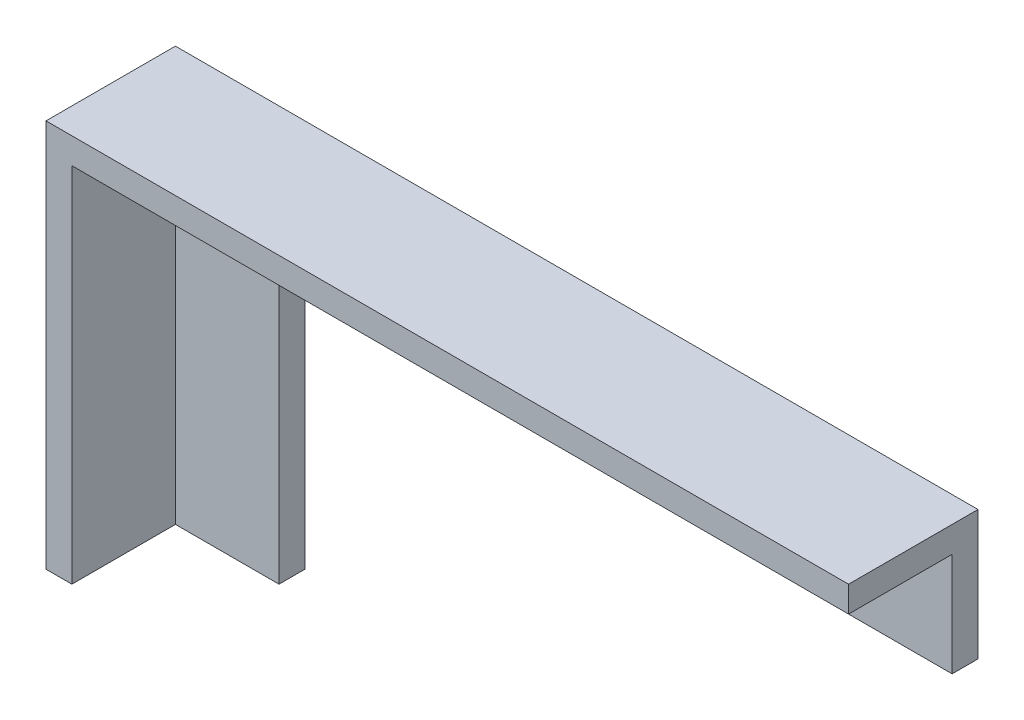
ISO-10303-21;
HEADER;
FILE_DESCRIPTION(('STEP AP214'),'2;1');
FILE_NAME('part.step','',(''),(''),'','','');
FILE_SCHEMA(('AUTOMOTIVE_DESIGN { 1 0 10303 214 1 1 1 1 }'));
ENDSEC;
DATA;
#1=APPLICATION_CONTEXT('core data for automotive mechanical design processes');
#2=APPLICATION_PROTOCOL_DEFINITION('international standard','automotive_design',2000,#1);
#3=PRODUCT_CONTEXT('',#1,'mechanical');
#4=PRODUCT('Part','Part','',(#3));
#5=PRODUCT_RELATED_PRODUCT_CATEGORY('part','',(#4));
#6=PRODUCT_DEFINITION_FORMATION('','',#4);
#7=PRODUCT_DEFINITION_CONTEXT('part definition',#1,'design');
#8=PRODUCT_DEFINITION('design','',#6,#7);
#9=PRODUCT_DEFINITION_SHAPE('','',#8);
#10=(LENGTH_UNIT() NAMED_UNIT(*) SI_UNIT(.MILLI.,.METRE.));
#11=(NAMED_UNIT(*) PLANE_ANGLE_UNIT() SI_UNIT($,.RADIAN.));
#12=(NAMED_UNIT(*) SI_UNIT($,.STERADIAN.) SOLID_ANGLE_UNIT());
#13=UNCERTAINTY_MEASURE_WITH_UNIT(LENGTH_MEASURE(1.E-05),#10,'distance_accuracy_value','');
#14=(GEOMETRIC_REPRESENTATION_CONTEXT(3) GLOBAL_UNCERTAINTY_ASSIGNED_CONTEXT((#13)) GLOBAL_UNIT_ASSIGNED_CONTEXT((#10,
#11,#12)) REPRESENTATION_CONTEXT('',''));
#15=CARTESIAN_POINT('',(0.,0.,0.));
#16=DIRECTION('',(0.,0.,1.));
#17=DIRECTION('',(1.,0.,0.));
#18=AXIS2_PLACEMENT_3D('',#15,#16,#17);
#19=CARTESIAN_POINT('',(5.,-5.,5.));
#20=DIRECTION('',(-1.,0.,0.));
#21=DIRECTION('',(0.,-1.,0.));
#22=AXIS2_PLACEMENT_3D('',#19,#20,#21);
#23=PLANE('',#22);
#24=DIRECTION('',(0.,1.,0.));
#25=VECTOR('',#24,1.);
#26=CARTESIAN_POINT('',(5.,0.,1.));
#27=LINE('',#26,#25);
#28=CARTESIAN_POINT('',(5.,-15.,1.));
#29=VERTEX_POINT('',#28);
#30=CARTESIAN_POINT('',(5.,-5.,1.));
#31=VERTEX_POINT('',#30);
#32=EDGE_CURVE('E145',#29,#31,#27,.T.);
#33=ORIENTED_EDGE('',*,*,#32,.F.);
#34=DIRECTION('',(0.,0.,-1.));
#35=VECTOR('',#34,1.);
#36=CARTESIAN_POINT('',(5.,-15.,5.));
#37=LINE('',#36,#35);
#38=CARTESIAN_POINT('',(5.,-15.,0.));
#39=VERTEX_POINT('',#38);
#40=EDGE_CURVE('E48',#29,#39,#37,.T.);
#41=ORIENTED_EDGE('',*,*,#40,.T.);
#42=DIRECTION('',(0.,1.,0.));
#43=VECTOR('',#42,1.);
#44=CARTESIAN_POINT('',(5.,-5.,0.));
#45=LINE('',#44,#43);
#46=CARTESIAN_POINT('',(5.,-5.,0.));
#47=VERTEX_POINT('',#46);
#48=EDGE_CURVE('E183',#39,#47,#45,.T.);
#49=ORIENTED_EDGE('',*,*,#48,.T.);
#50=DIRECTION('',(0.,0.,-1.));
#51=VECTOR('',#50,1.);
#52=CARTESIAN_POINT('',(5.,-5.,5.));
#53=LINE('',#52,#51);
#54=EDGE_CURVE('E204',#31,#47,#53,.T.);
#55=ORIENTED_EDGE('',*,*,#54,.F.);
#56=EDGE_LOOP('',(#33,#41,#49,#55));
#57=FACE_BOUND('',#56,.T.);
#58=ADVANCED_FACE('F39',(#57),#23,.F.);
#59=CARTESIAN_POINT('',(31.,-5.,5.));
#60=DIRECTION('',(0.,1.,0.));
#61=DIRECTION('',(-1.,0.,0.));
#62=AXIS2_PLACEMENT_3D('',#59,#60,#61);
#63=PLANE('',#62);
#64=DIRECTION('',(1.,0.,0.));
#65=VECTOR('',#64,1.);
#66=CARTESIAN_POINT('',(0.,-5.00000000000001,1.));
#67=LINE('',#66,#65);
#68=CARTESIAN_POINT('',(31.,-5.,1.));
#69=VERTEX_POINT('',#68);
#70=EDGE_CURVE('E150',#31,#69,#67,.T.);
#71=ORIENTED_EDGE('',*,*,#70,.F.);
#72=ORIENTED_EDGE('',*,*,#54,.T.);
#73=DIRECTION('',(1.,0.,0.));
#74=VECTOR('',#73,1.);
#75=CARTESIAN_POINT('',(31.,-5.,0.));
#76=LINE('',#75,#74);
#77=CARTESIAN_POINT('',(31.,-5.,0.));
#78=VERTEX_POINT('',#77);
#79=EDGE_CURVE('E187',#47,#78,#76,.T.);
#80=ORIENTED_EDGE('',*,*,#79,.T.);
#81=DIRECTION('',(0.,0.,-1.));
#82=VECTOR('',#81,1.);
#83=CARTESIAN_POINT('',(31.,-5.,5.));
#84=LINE('',#83,#82);
#85=EDGE_CURVE('E201',#69,#78,#84,.T.);
#86=ORIENTED_EDGE('',*,*,#85,.F.);
#87=EDGE_LOOP('',(#71,#72,#80,#86));
#88=FACE_BOUND('',#87,.T.);
#89=ADVANCED_FACE('F222',(#88),#63,.F.);
#90=CARTESIAN_POINT('',(31.,0.,5.));
#91=DIRECTION('',(-1.,0.,0.));
#92=DIRECTION('',(0.,0.,1.));
#93=AXIS2_PLACEMENT_3D('',#90,#91,#92);
#94=PLANE('',#93);
#95=DIRECTION('',(0.,0.,1.));
#96=VECTOR('',#95,1.);
#97=CARTESIAN_POINT('',(31.,-1.,1.));
#98=LINE('',#97,#96);
#99=CARTESIAN_POINT('',(31.,-1.,1.));
#100=VERTEX_POINT('',#99);
#101=CARTESIAN_POINT('',(31.,-1.,5.));
#102=VERTEX_POINT('',#101);
#103=EDGE_CURVE('E159',#100,#102,#98,.T.);
#104=ORIENTED_EDGE('',*,*,#103,.F.);
#105=DIRECTION('',(0.,1.,0.));
#106=VECTOR('',#105,1.);
#107=CARTESIAN_POINT('',(31.,0.,1.));
#108=LINE('',#107,#106);
#109=EDGE_CURVE('E128',#69,#100,#108,.T.);
#110=ORIENTED_EDGE('',*,*,#109,.F.);
#111=ORIENTED_EDGE('',*,*,#85,.T.);
#112=DIRECTION('',(0.,1.,0.));
#113=VECTOR('',#112,1.);
#114=CARTESIAN_POINT('',(31.,0.,0.));
#115=LINE('',#114,#113);
#116=CARTESIAN_POINT('',(31.,0.,0.));
#117=VERTEX_POINT('',#116);
#118=EDGE_CURVE('E191',#78,#117,#115,.T.);
#119=ORIENTED_EDGE('',*,*,#118,.T.);
#120=DIRECTION('',(0.,0.,-1.));
#121=VECTOR('',#120,1.);
#122=CARTESIAN_POINT('',(31.,0.,5.));
#123=LINE('',#122,#121);
#124=CARTESIAN_POINT('',(31.,0.,5.));
#125=VERTEX_POINT('',#124);
#126=EDGE_CURVE('E198',#125,#117,#123,.T.);
#127=ORIENTED_EDGE('',*,*,#126,.F.);
#128=DIRECTION('',(0.,1.,0.));
#129=VECTOR('',#128,1.);
#130=CARTESIAN_POINT('',(31.,0.,5.));
#131=LINE('',#130,#129);
#132=EDGE_CURVE('E170',#102,#125,#131,.T.);
#133=ORIENTED_EDGE('',*,*,#132,.F.);
#134=EDGE_LOOP('',(#104,#110,#111,#119,#127,#133));
#135=FACE_BOUND('',#134,.T.);
#136=ADVANCED_FACE('F224',(#135),#94,.F.);
#137=CARTESIAN_POINT('',(0.,0.,5.));
#138=DIRECTION('',(0.,0.,-1.));
#139=DIRECTION('',(-1.,0.,0.));
#140=AXIS2_PLACEMENT_3D('',#137,#138,#139);
#141=PLANE('',#140);
#142=DIRECTION('',(1.,0.,0.));
#143=VECTOR('',#142,1.);
#144=CARTESIAN_POINT('',(0.,-1.,5.));
#145=LINE('',#144,#143);
#146=CARTESIAN_POINT('',(1.,-1.,5.));
#147=VERTEX_POINT('',#146);
#148=EDGE_CURVE('E55',#147,#102,#145,.T.);
#149=ORIENTED_EDGE('',*,*,#148,.T.);
#150=ORIENTED_EDGE('',*,*,#132,.T.);
#151=DIRECTION('',(-1.,0.,0.));
#152=VECTOR('',#151,1.);
#153=CARTESIAN_POINT('',(0.,0.,5.));
#154=LINE('',#153,#152);
#155=CARTESIAN_POINT('',(0.,0.,5.));
#156=VERTEX_POINT('',#155);
#157=EDGE_CURVE('E64',#125,#156,#154,.T.);
#158=ORIENTED_EDGE('',*,*,#157,.T.);
#159=DIRECTION('',(0.,-1.,0.));
#160=VECTOR('',#159,1.);
#161=CARTESIAN_POINT('',(0.,-15.,5.));
#162=LINE('',#161,#160);
#163=CARTESIAN_POINT('',(0.,-15.,5.));
#164=VERTEX_POINT('',#163);
#165=EDGE_CURVE('E165',#156,#164,#162,.T.);
#166=ORIENTED_EDGE('',*,*,#165,.T.);
#167=DIRECTION('',(1.,0.,0.));
#168=VECTOR('',#167,1.);
#169=CARTESIAN_POINT('',(5.,-15.,5.));
#170=LINE('',#169,#168);
#171=CARTESIAN_POINT('',(1.,-15.,5.));
#172=VERTEX_POINT('',#171);
#173=EDGE_CURVE('E96',#164,#172,#170,.T.);
#174=ORIENTED_EDGE('',*,*,#173,.T.);
#175=DIRECTION('',(0.,-1.,0.));
#176=VECTOR('',#175,1.);
#177=CARTESIAN_POINT('',(1.,0.,5.));
#178=LINE('',#177,#176);
#179=EDGE_CURVE('E138',#147,#172,#178,.T.);
#180=ORIENTED_EDGE('',*,*,#179,.F.);
#181=EDGE_LOOP('',(#149,#150,#158,#166,#174,#180));
#182=FACE_BOUND('',#181,.T.);
#183=ADVANCED_FACE('F227',(#182),#141,.F.);
#184=CARTESIAN_POINT('',(0.,-15.,5.));
#185=DIRECTION('',(1.,0.,0.));
#186=DIRECTION('',(0.,0.,-1.));
#187=AXIS2_PLACEMENT_3D('',#184,#185,#186);
#188=PLANE('',#187);
#189=DIRECTION('',(0.,-1.,0.));
#190=VECTOR('',#189,1.);
#191=CARTESIAN_POINT('',(0.,-15.,0.));
#192=LINE('',#191,#190);
#193=CARTESIAN_POINT('',(0.,0.,0.));
#194=VERTEX_POINT('',#193);
#195=CARTESIAN_POINT('',(0.,-15.,0.));
#196=VERTEX_POINT('',#195);
#197=EDGE_CURVE('E162',#194,#196,#192,.T.);
#198=ORIENTED_EDGE('',*,*,#197,.T.);
#199=DIRECTION('',(0.,0.,-1.));
#200=VECTOR('',#199,1.);
#201=CARTESIAN_POINT('',(0.,-15.,5.));
#202=LINE('',#201,#200);
#203=EDGE_CURVE('E11',#164,#196,#202,.T.);
#204=ORIENTED_EDGE('',*,*,#203,.F.);
#205=ORIENTED_EDGE('',*,*,#165,.F.);
#206=DIRECTION('',(0.,0.,-1.));
#207=VECTOR('',#206,1.);
#208=CARTESIAN_POINT('',(0.,0.,5.));
#209=LINE('',#208,#207);
#210=EDGE_CURVE('E175',#156,#194,#209,.T.);
#211=ORIENTED_EDGE('',*,*,#210,.T.);
#212=EDGE_LOOP('',(#198,#204,#205,#211));
#213=FACE_BOUND('',#212,.T.);
#214=ADVANCED_FACE('F41',(#213),#188,.F.);
#215=CARTESIAN_POINT('',(5.,-15.,5.));
#216=DIRECTION('',(0.,1.,0.));
#217=DIRECTION('',(0.,0.,1.));
#218=AXIS2_PLACEMENT_3D('',#215,#216,#217);
#219=PLANE('',#218);
#220=DIRECTION('',(1.,0.,0.));
#221=VECTOR('',#220,1.);
#222=CARTESIAN_POINT('',(0.,-15.,1.));
#223=LINE('',#222,#221);
#224=CARTESIAN_POINT('',(1.,-15.,1.));
#225=VERTEX_POINT('',#224);
#226=EDGE_CURVE('E142',#225,#29,#223,.T.);
#227=ORIENTED_EDGE('',*,*,#226,.F.);
#228=DIRECTION('',(0.,0.,1.));
#229=VECTOR('',#228,1.);
#230=CARTESIAN_POINT('',(1.,-15.,1.));
#231=LINE('',#230,#229);
#232=EDGE_CURVE('E127',#225,#172,#231,.T.);
#233=ORIENTED_EDGE('',*,*,#232,.T.);
#234=ORIENTED_EDGE('',*,*,#173,.F.);
#235=ORIENTED_EDGE('',*,*,#203,.T.);
#236=DIRECTION('',(1.,0.,0.));
#237=VECTOR('',#236,1.);
#238=CARTESIAN_POINT('',(5.,-15.,0.));
#239=LINE('',#238,#237);
#240=EDGE_CURVE('E179',#196,#39,#239,.T.);
#241=ORIENTED_EDGE('',*,*,#240,.T.);
#242=ORIENTED_EDGE('',*,*,#40,.F.);
#243=EDGE_LOOP('',(#227,#233,#234,#235,#241,#242));
#244=FACE_BOUND('',#243,.T.);
#245=ADVANCED_FACE('F213',(#244),#219,.F.);
#246=CARTESIAN_POINT('',(0.,0.,5.));
#247=DIRECTION('',(0.,-1.,0.));
#248=DIRECTION('',(0.,0.,-1.));
#249=AXIS2_PLACEMENT_3D('',#246,#247,#248);
#250=PLANE('',#249);
#251=DIRECTION('',(-1.,0.,0.));
#252=VECTOR('',#251,1.);
#253=CARTESIAN_POINT('',(0.,0.,0.));
#254=LINE('',#253,#252);
#255=EDGE_CURVE('E90',#117,#194,#254,.T.);
#256=ORIENTED_EDGE('',*,*,#255,.T.);
#257=ORIENTED_EDGE('',*,*,#210,.F.);
#258=ORIENTED_EDGE('',*,*,#157,.F.);
#259=ORIENTED_EDGE('',*,*,#126,.T.);
#260=EDGE_LOOP('',(#256,#257,#258,#259));
#261=FACE_BOUND('',#260,.T.);
#262=ADVANCED_FACE('F230',(#261),#250,.F.);
#263=CARTESIAN_POINT('',(0.,0.,0.));
#264=DIRECTION('',(0.,0.,-1.));
#265=DIRECTION('',(-1.,0.,0.));
#266=AXIS2_PLACEMENT_3D('',#263,#264,#265);
#267=PLANE('',#266);
#268=ORIENTED_EDGE('',*,*,#197,.F.);
#269=ORIENTED_EDGE('',*,*,#255,.F.);
#270=ORIENTED_EDGE('',*,*,#118,.F.);
#271=ORIENTED_EDGE('',*,*,#79,.F.);
#272=ORIENTED_EDGE('',*,*,#48,.F.);
#273=ORIENTED_EDGE('',*,*,#240,.F.);
#274=EDGE_LOOP('',(#268,#269,#270,#271,#272,#273));
#275=FACE_BOUND('',#274,.T.);
#276=ADVANCED_FACE('F217',(#275),#267,.T.);
#277=CARTESIAN_POINT('',(0.,-1.,1.));
#278=DIRECTION('',(0.,-1.,0.));
#279=DIRECTION('',(0.,0.,-1.));
#280=AXIS2_PLACEMENT_3D('',#277,#278,#279);
#281=PLANE('',#280);
#282=ORIENTED_EDGE('',*,*,#148,.F.);
#283=DIRECTION('',(0.,0.,1.));
#284=VECTOR('',#283,1.);
#285=CARTESIAN_POINT('',(1.,-1.,1.));
#286=LINE('',#285,#284);
#287=CARTESIAN_POINT('',(1.,-1.,1.));
#288=VERTEX_POINT('',#287);
#289=EDGE_CURVE('E118',#288,#147,#286,.T.);
#290=ORIENTED_EDGE('',*,*,#289,.F.);
#291=DIRECTION('',(1.,0.,0.));
#292=VECTOR('',#291,1.);
#293=CARTESIAN_POINT('',(0.,-1.,1.));
#294=LINE('',#293,#292);
#295=EDGE_CURVE('E121',#288,#100,#294,.T.);
#296=ORIENTED_EDGE('',*,*,#295,.T.);
#297=ORIENTED_EDGE('',*,*,#103,.T.);
#298=EDGE_LOOP('',(#282,#290,#296,#297));
#299=FACE_BOUND('',#298,.T.);
#300=ADVANCED_FACE('F120',(#299),#281,.T.);
#301=CARTESIAN_POINT('',(1.,0.,1.));
#302=DIRECTION('',(-1.,0.,0.));
#303=DIRECTION('',(0.,0.,1.));
#304=AXIS2_PLACEMENT_3D('',#301,#302,#303);
#305=PLANE('',#304);
#306=ORIENTED_EDGE('',*,*,#179,.T.);
#307=ORIENTED_EDGE('',*,*,#232,.F.);
#308=DIRECTION('',(0.,-1.,0.));
#309=VECTOR('',#308,1.);
#310=CARTESIAN_POINT('',(1.,0.,1.));
#311=LINE('',#310,#309);
#312=EDGE_CURVE('E133',#288,#225,#311,.T.);
#313=ORIENTED_EDGE('',*,*,#312,.F.);
#314=ORIENTED_EDGE('',*,*,#289,.T.);
#315=EDGE_LOOP('',(#306,#307,#313,#314));
#316=FACE_BOUND('',#315,.T.);
#317=ADVANCED_FACE('F140',(#316),#305,.F.);
#318=CARTESIAN_POINT('',(0.,0.,1.));
#319=DIRECTION('',(0.,0.,1.));
#320=DIRECTION('',(1.,0.,0.));
#321=AXIS2_PLACEMENT_3D('',#318,#319,#320);
#322=PLANE('',#321);
#323=ORIENTED_EDGE('',*,*,#295,.F.);
#324=ORIENTED_EDGE('',*,*,#312,.T.);
#325=ORIENTED_EDGE('',*,*,#226,.T.);
#326=ORIENTED_EDGE('',*,*,#32,.T.);
#327=ORIENTED_EDGE('',*,*,#70,.T.);
#328=ORIENTED_EDGE('',*,*,#109,.T.);
#329=EDGE_LOOP('',(#323,#324,#325,#326,#327,#328));
#330=FACE_BOUND('',#329,.T.);
#331=ADVANCED_FACE('F132',(#330),#322,.T.);
#332=CLOSED_SHELL('',(#58,#89,#136,#183,#214,#245,#262,#276,#300,#317,#331));
#333=MANIFOLD_SOLID_BREP('B2',#332);
#334=ADVANCED_BREP_SHAPE_REPRESENTATION('',(#18,#333),#14);
#335=SHAPE_DEFINITION_REPRESENTATION(#9,#334);
ENDSEC;
END-ISO-10303-21;
